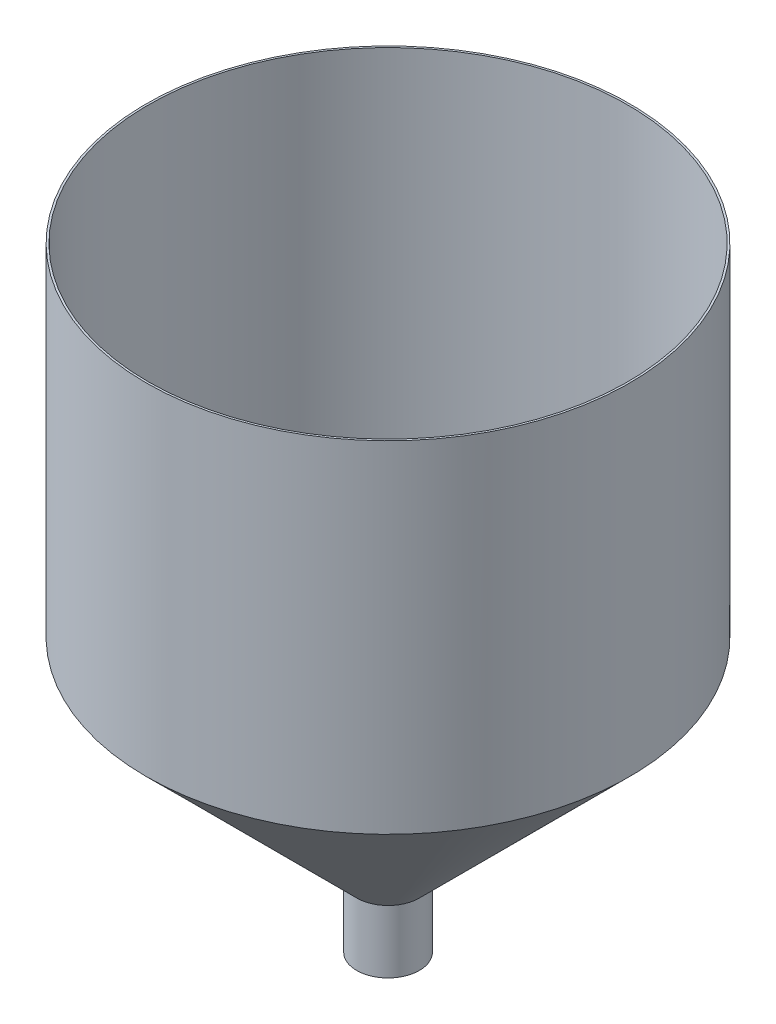
ISO-10303-21;
HEADER;
FILE_DESCRIPTION(('STEP AP214'),'2;1');
FILE_NAME('part.step','',(''),(''),'','','');
FILE_SCHEMA(('AUTOMOTIVE_DESIGN { 1 0 10303 214 1 1 1 1 }'));
ENDSEC;
DATA;
#1=APPLICATION_CONTEXT('core data for automotive mechanical design processes');
#2=APPLICATION_PROTOCOL_DEFINITION('international standard','automotive_design',2000,#1);
#3=PRODUCT_CONTEXT('',#1,'mechanical');
#4=PRODUCT('Part','Part','',(#3));
#5=PRODUCT_RELATED_PRODUCT_CATEGORY('part','',(#4));
#6=PRODUCT_DEFINITION_FORMATION('','',#4);
#7=PRODUCT_DEFINITION_CONTEXT('part definition',#1,'design');
#8=PRODUCT_DEFINITION('design','',#6,#7);
#9=PRODUCT_DEFINITION_SHAPE('','',#8);
#10=(LENGTH_UNIT() NAMED_UNIT(*) SI_UNIT(.MILLI.,.METRE.));
#11=(NAMED_UNIT(*) PLANE_ANGLE_UNIT() SI_UNIT($,.RADIAN.));
#12=(NAMED_UNIT(*) SI_UNIT($,.STERADIAN.) SOLID_ANGLE_UNIT());
#13=UNCERTAINTY_MEASURE_WITH_UNIT(LENGTH_MEASURE(1.E-05),#10,'distance_accuracy_value','');
#14=(GEOMETRIC_REPRESENTATION_CONTEXT(3) GLOBAL_UNCERTAINTY_ASSIGNED_CONTEXT((#13)) GLOBAL_UNIT_ASSIGNED_CONTEXT((#10,
#11,#12)) REPRESENTATION_CONTEXT('',''));
#15=CARTESIAN_POINT('',(0.,0.,0.));
#16=DIRECTION('',(0.,0.,1.));
#17=DIRECTION('',(1.,0.,0.));
#18=AXIS2_PLACEMENT_3D('',#15,#16,#17);
#19=CARTESIAN_POINT('',(0.,-543.2,0.));
#20=DIRECTION('',(0.,1.,0.));
#21=DIRECTION('',(0.,0.,1.));
#22=AXIS2_PLACEMENT_3D('',#19,#20,#21);
#23=CYLINDRICAL_SURFACE('',#22,385.3);
#24=CARTESIAN_POINT('',(0.,-543.2,0.));
#25=DIRECTION('',(0.,-1.,0.));
#26=DIRECTION('',(0.,0.,-1.));
#27=AXIS2_PLACEMENT_3D('',#24,#25,#26);
#28=CIRCLE('',#27,385.3);
#29=CARTESIAN_POINT('',(0.,-543.2,-385.3));
#30=VERTEX_POINT('',#29);
#31=EDGE_CURVE('E57',#30,#30,#28,.T.);
#32=ORIENTED_EDGE('',*,*,#31,.F.);
#33=EDGE_LOOP('',(#32));
#34=FACE_BOUND('',#33,.T.);
#35=CARTESIAN_POINT('',(0.,0.,0.));
#36=DIRECTION('',(0.,1.,0.));
#37=DIRECTION('',(0.,0.,1.));
#38=AXIS2_PLACEMENT_3D('',#35,#36,#37);
#39=CIRCLE('',#38,385.3);
#40=CARTESIAN_POINT('',(0.,0.,385.3));
#41=VERTEX_POINT('',#40);
#42=EDGE_CURVE('E13',#41,#41,#39,.T.);
#43=ORIENTED_EDGE('',*,*,#42,.F.);
#44=EDGE_LOOP('',(#43));
#45=FACE_BOUND('',#44,.T.);
#46=ADVANCED_FACE('F48',(#34,#45),#23,.T.);
#47=CARTESIAN_POINT('',(0.,0.,0.));
#48=DIRECTION('',(0.,1.,0.));
#49=DIRECTION('',(0.,0.,1.));
#50=AXIS2_PLACEMENT_3D('',#47,#48,#49);
#51=PLANE('',#50);
#52=CARTESIAN_POINT('',(0.,0.,0.));
#53=DIRECTION('',(0.,1.,0.));
#54=DIRECTION('',(0.,0.,1.));
#55=AXIS2_PLACEMENT_3D('',#52,#53,#54);
#56=CIRCLE('',#55,382.125);
#57=CARTESIAN_POINT('',(0.,0.,382.125));
#58=VERTEX_POINT('',#57);
#59=EDGE_CURVE('E72',#58,#58,#56,.T.);
#60=ORIENTED_EDGE('',*,*,#59,.F.);
#61=EDGE_LOOP('',(#60));
#62=FACE_BOUND('',#61,.T.);
#63=ORIENTED_EDGE('',*,*,#42,.T.);
#64=EDGE_LOOP('',(#63));
#65=FACE_BOUND('',#64,.T.);
#66=ADVANCED_FACE('F98',(#62,#65),#51,.T.);
#67=CARTESIAN_POINT('',(0.,-878.5,0.));
#68=DIRECTION('',(0.,1.,0.));
#69=DIRECTION('',(0.,0.,1.));
#70=AXIS2_PLACEMENT_3D('',#67,#68,#69);
#71=CONICAL_SURFACE('',#70,50.,0.785398163397449);
#72=CARTESIAN_POINT('',(0.,-878.5,0.));
#73=DIRECTION('',(0.,-1.,0.));
#74=DIRECTION('',(0.,0.,-1.));
#75=AXIS2_PLACEMENT_3D('',#72,#73,#74);
#76=CIRCLE('',#75,50.);
#77=CARTESIAN_POINT('',(0.,-878.5,-50.));
#78=VERTEX_POINT('',#77);
#79=EDGE_CURVE('E68',#78,#78,#76,.T.);
#80=ORIENTED_EDGE('',*,*,#79,.F.);
#81=EDGE_LOOP('',(#80));
#82=FACE_BOUND('',#81,.T.);
#83=ORIENTED_EDGE('',*,*,#31,.T.);
#84=EDGE_LOOP('',(#83));
#85=FACE_BOUND('',#84,.T.);
#86=ADVANCED_FACE('F90',(#82,#85),#71,.T.);
#87=CARTESIAN_POINT('',(0.,-978.5,0.));
#88=DIRECTION('',(0.,1.,0.));
#89=DIRECTION('',(0.,0.,1.));
#90=AXIS2_PLACEMENT_3D('',#87,#88,#89);
#91=CYLINDRICAL_SURFACE('',#90,50.);
#92=CARTESIAN_POINT('',(0.,-978.5,0.));
#93=DIRECTION('',(0.,-1.,0.));
#94=DIRECTION('',(0.,0.,-1.));
#95=AXIS2_PLACEMENT_3D('',#92,#93,#94);
#96=CIRCLE('',#95,50.);
#97=CARTESIAN_POINT('',(0.,-978.5,-50.));
#98=VERTEX_POINT('',#97);
#99=EDGE_CURVE('E62',#98,#98,#96,.T.);
#100=ORIENTED_EDGE('',*,*,#99,.F.);
#101=EDGE_LOOP('',(#100));
#102=FACE_BOUND('',#101,.T.);
#103=ORIENTED_EDGE('',*,*,#79,.T.);
#104=EDGE_LOOP('',(#103));
#105=FACE_BOUND('',#104,.T.);
#106=ADVANCED_FACE('F69',(#102,#105),#91,.T.);
#107=CARTESIAN_POINT('',(0.,-978.5,0.));
#108=DIRECTION('',(0.,-1.,0.));
#109=DIRECTION('',(0.,0.,-1.));
#110=AXIS2_PLACEMENT_3D('',#107,#108,#109);
#111=PLANE('',#110);
#112=CARTESIAN_POINT('',(0.,-978.5,0.));
#113=DIRECTION('',(0.,-1.,0.));
#114=DIRECTION('',(0.,0.,-1.));
#115=AXIS2_PLACEMENT_3D('',#112,#113,#114);
#116=CIRCLE('',#115,46.825);
#117=CARTESIAN_POINT('',(0.,-978.5,-46.825));
#118=VERTEX_POINT('',#117);
#119=EDGE_CURVE('E81',#118,#118,#116,.T.);
#120=ORIENTED_EDGE('',*,*,#119,.F.);
#121=EDGE_LOOP('',(#120));
#122=FACE_BOUND('',#121,.T.);
#123=ORIENTED_EDGE('',*,*,#99,.T.);
#124=EDGE_LOOP('',(#123));
#125=FACE_BOUND('',#124,.T.);
#126=ADVANCED_FACE('F130',(#122,#125),#111,.T.);
#127=CARTESIAN_POINT('',(0.,-543.2,0.));
#128=DIRECTION('',(0.,1.,0.));
#129=DIRECTION('',(0.,0.,1.));
#130=AXIS2_PLACEMENT_3D('',#127,#128,#129);
#131=CYLINDRICAL_SURFACE('',#130,382.125);
#132=CARTESIAN_POINT('',(0.,-541.884871939466,0.));
#133=DIRECTION('',(0.,1.,0.));
#134=DIRECTION('',(0.,0.,1.));
#135=AXIS2_PLACEMENT_3D('',#132,#133,#134);
#136=CIRCLE('',#135,382.125);
#137=CARTESIAN_POINT('',(0.,-541.884871939466,382.125));
#138=VERTEX_POINT('',#137);
#139=EDGE_CURVE('E76',#138,#138,#136,.F.);
#140=ORIENTED_EDGE('',*,*,#139,.T.);
#141=EDGE_LOOP('',(#140));
#142=FACE_BOUND('',#141,.T.);
#143=ORIENTED_EDGE('',*,*,#59,.T.);
#144=EDGE_LOOP('',(#143));
#145=FACE_BOUND('',#144,.T.);
#146=ADVANCED_FACE('F137',(#142,#145),#131,.F.);
#147=CARTESIAN_POINT('',(0.,-876.254935969733,0.));
#148=DIRECTION('',(0.,1.,0.));
#149=DIRECTION('',(0.,0.,1.));
#150=AXIS2_PLACEMENT_3D('',#147,#148,#149);
#151=CONICAL_SURFACE('',#150,47.7549359697327,0.785398163397449);
#152=CARTESIAN_POINT('',(0.,-877.184871939465,0.));
#153=DIRECTION('',(0.,1.,0.));
#154=DIRECTION('',(0.,0.,1.));
#155=AXIS2_PLACEMENT_3D('',#152,#153,#154);
#156=CIRCLE('',#155,46.825);
#157=CARTESIAN_POINT('',(0.,-877.184871939465,46.825));
#158=VERTEX_POINT('',#157);
#159=EDGE_CURVE('E85',#158,#158,#156,.F.);
#160=CARTESIAN_POINT('',(0.,-877.184871939465,46.825));
#161=CARTESIAN_POINT('',(0.,-873.692163606132,50.3177083333333));
#162=CARTESIAN_POINT('',(0.,-870.199455272799,53.8104166666666));
#163=CARTESIAN_POINT('',(0.,-863.214038606132,60.7958333333333));
#164=CARTESIAN_POINT('',(0.,-859.721330272799,64.2885416666666));
#165=CARTESIAN_POINT('',(0.,-852.735913606132,71.2739583333333));
#166=CARTESIAN_POINT('',(0.,-849.243205272799,74.7666666666666));
#167=CARTESIAN_POINT('',(0.,-842.257788606132,81.7520833333333));
#168=CARTESIAN_POINT('',(0.,-838.765080272799,85.2447916666666));
#169=CARTESIAN_POINT('',(0.,-831.779663606132,92.2302083333333));
#170=CARTESIAN_POINT('',(0.,-828.286955272799,95.7229166666666));
#171=CARTESIAN_POINT('',(0.,-821.301538606132,102.708333333333));
#172=CARTESIAN_POINT('',(0.,-817.808830272799,106.201041666667));
#173=CARTESIAN_POINT('',(0.,-810.823413606132,113.186458333333));
#174=CARTESIAN_POINT('',(0.,-807.330705272799,116.679166666667));
#175=CARTESIAN_POINT('',(0.,-800.345288606132,123.664583333333));
#176=CARTESIAN_POINT('',(0.,-796.852580272799,127.157291666667));
#177=CARTESIAN_POINT('',(0.,-789.867163606132,134.142708333333));
#178=CARTESIAN_POINT('',(0.,-786.374455272799,137.635416666667));
#179=CARTESIAN_POINT('',(0.,-779.389038606132,144.620833333333));
#180=CARTESIAN_POINT('',(0.,-775.896330272799,148.113541666667));
#181=CARTESIAN_POINT('',(0.,-768.910913606132,155.098958333333));
#182=CARTESIAN_POINT('',(0.,-765.418205272799,158.591666666667));
#183=CARTESIAN_POINT('',(0.,-758.432788606132,165.577083333333));
#184=CARTESIAN_POINT('',(0.,-754.940080272799,169.069791666667));
#185=CARTESIAN_POINT('',(0.,-747.954663606132,176.055208333333));
#186=CARTESIAN_POINT('',(0.,-744.461955272799,179.547916666667));
#187=CARTESIAN_POINT('',(0.,-737.476538606132,186.533333333333));
#188=CARTESIAN_POINT('',(0.,-733.983830272799,190.026041666667));
#189=CARTESIAN_POINT('',(0.,-726.998413606132,197.011458333333));
#190=CARTESIAN_POINT('',(0.,-723.505705272799,200.504166666667));
#191=CARTESIAN_POINT('',(0.,-716.520288606132,207.489583333333));
#192=CARTESIAN_POINT('',(0.,-713.027580272799,210.982291666667));
#193=CARTESIAN_POINT('',(0.,-706.042163606132,217.967708333333));
#194=CARTESIAN_POINT('',(0.,-702.549455272799,221.460416666667));
#195=CARTESIAN_POINT('',(0.,-695.564038606132,228.445833333333));
#196=CARTESIAN_POINT('',(0.,-692.071330272799,231.938541666667));
#197=CARTESIAN_POINT('',(0.,-685.085913606132,238.923958333333));
#198=CARTESIAN_POINT('',(0.,-681.593205272799,242.416666666667));
#199=CARTESIAN_POINT('',(0.,-674.607788606132,249.402083333333));
#200=CARTESIAN_POINT('',(0.,-671.115080272799,252.894791666667));
#201=CARTESIAN_POINT('',(0.,-664.129663606132,259.880208333333));
#202=CARTESIAN_POINT('',(0.,-660.636955272799,263.372916666667));
#203=CARTESIAN_POINT('',(0.,-653.651538606132,270.358333333333));
#204=CARTESIAN_POINT('',(0.,-650.158830272799,273.851041666667));
#205=CARTESIAN_POINT('',(0.,-643.173413606132,280.836458333333));
#206=CARTESIAN_POINT('',(0.,-639.680705272799,284.329166666667));
#207=CARTESIAN_POINT('',(0.,-632.695288606132,291.314583333333));
#208=CARTESIAN_POINT('',(0.,-629.202580272799,294.807291666667));
#209=CARTESIAN_POINT('',(0.,-622.217163606132,301.792708333333));
#210=CARTESIAN_POINT('',(0.,-618.724455272799,305.285416666667));
#211=CARTESIAN_POINT('',(0.,-611.739038606132,312.270833333333));
#212=CARTESIAN_POINT('',(0.,-608.246330272799,315.763541666667));
#213=CARTESIAN_POINT('',(0.,-601.260913606132,322.748958333333));
#214=CARTESIAN_POINT('',(0.,-597.768205272799,326.241666666667));
#215=CARTESIAN_POINT('',(0.,-590.782788606132,333.227083333333));
#216=CARTESIAN_POINT('',(0.,-587.290080272799,336.719791666666));
#217=CARTESIAN_POINT('',(0.,-580.304663606132,343.705208333333));
#218=CARTESIAN_POINT('',(0.,-576.811955272799,347.197916666667));
#219=CARTESIAN_POINT('',(0.,-569.826538606132,354.183333333333));
#220=CARTESIAN_POINT('',(0.,-566.333830272799,357.676041666666));
#221=CARTESIAN_POINT('',(0.,-559.348413606132,364.661458333333));
#222=CARTESIAN_POINT('',(0.,-555.855705272799,368.154166666667));
#223=CARTESIAN_POINT('',(0.,-548.870288606132,375.139583333333));
#224=CARTESIAN_POINT('',(0.,-545.377580272799,378.632291666667));
#225=CARTESIAN_POINT('',(0.,-541.884871939466,382.125));
#226=B_SPLINE_CURVE_WITH_KNOTS('',3,(#160,#161,#162,#163,#164,#165,#166,#167,#168,#169,#170,
#171,#172,#173,#174,#175,#176,#177,#178,#179,#180,#181,#182,#183,#184,#185,#186,#187,#188,#189,
#190,#191,#192,#193,#194,#195,#196,#197,#198,#199,#200,#201,#202,#203,#204,#205,#206,#207,#208,
#209,#210,#211,#212,#213,#214,#215,#216,#217,#218,#219,#220,#221,#222,#223,#224,#225),
.UNSPECIFIED.,.F.,.F.,(4,2,2,2,2,2,2,2,2,2,2,2,2,2,2,2,2,2,2,2,2,2,2,2,2,2,2,2,2,2,2,2,4),(0.,
14.8183064832406,29.6366129664812,44.4549194497218,59.2732259329623,74.0915324162029,
88.9098388994435,103.728145382684,118.546451865925,133.364758349165,148.183064832406,
163.001371315646,177.819677798887,192.637984282127,207.456290765368,222.274597248609,
237.092903731849,251.91121021509,266.72951669833,281.547823181571,296.366129664812,
311.184436148052,326.002742631293,340.821049114533,355.639355597774,370.457662081015,
385.275968564255,400.094275047496,414.912581530736,429.730888013977,444.549194497217,
459.367500980458,474.185807463699),.UNSPECIFIED.);
#227=EDGE_CURVE('BSEAM142',#158,#138,#226,.T.);
#228=ORIENTED_EDGE('',*,*,#159,.T.);
#229=ORIENTED_EDGE('',*,*,#139,.F.);
#230=ORIENTED_EDGE('',*,*,#227,.T.);
#231=ORIENTED_EDGE('',*,*,#227,.F.);
#232=EDGE_LOOP('',(#228,#230,#229,#231));
#233=FACE_BOUND('',#232,.T.);
#234=ADVANCED_FACE('F142',(#233),#151,.F.);
#235=CARTESIAN_POINT('',(0.,-978.5,0.));
#236=DIRECTION('',(0.,1.,0.));
#237=DIRECTION('',(0.,0.,1.));
#238=AXIS2_PLACEMENT_3D('',#235,#236,#237);
#239=CYLINDRICAL_SURFACE('',#238,46.825);
#240=ORIENTED_EDGE('',*,*,#119,.T.);
#241=EDGE_LOOP('',(#240));
#242=FACE_BOUND('',#241,.T.);
#243=ORIENTED_EDGE('',*,*,#159,.F.);
#244=EDGE_LOOP('',(#243));
#245=FACE_BOUND('',#244,.T.);
#246=ADVANCED_FACE('F152',(#242,#245),#239,.F.);
#247=CLOSED_SHELL('',(#46,#66,#86,#106,#126,#146,#234,#246));
#248=MANIFOLD_SOLID_BREP('B2',#247);
#249=ADVANCED_BREP_SHAPE_REPRESENTATION('',(#18,#248),#14);
#250=SHAPE_DEFINITION_REPRESENTATION(#9,#249);
ENDSEC;
END-ISO-10303-21;
